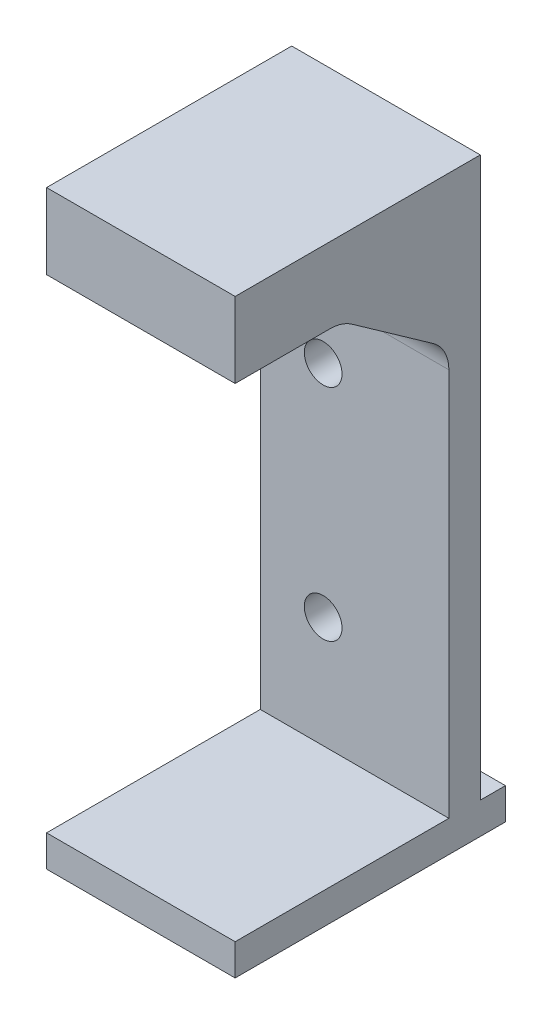
ISO-10303-21;
HEADER;
FILE_DESCRIPTION(('STEP AP214'),'2;1');
FILE_NAME('part.step','',(''),(''),'','','');
FILE_SCHEMA(('AUTOMOTIVE_DESIGN { 1 0 10303 214 1 1 1 1 }'));
ENDSEC;
DATA;
#1=APPLICATION_CONTEXT('core data for automotive mechanical design processes');
#2=APPLICATION_PROTOCOL_DEFINITION('international standard','automotive_design',2000,#1);
#3=PRODUCT_CONTEXT('',#1,'mechanical');
#4=PRODUCT('Part','Part','',(#3));
#5=PRODUCT_RELATED_PRODUCT_CATEGORY('part','',(#4));
#6=PRODUCT_DEFINITION_FORMATION('','',#4);
#7=PRODUCT_DEFINITION_CONTEXT('part definition',#1,'design');
#8=PRODUCT_DEFINITION('design','',#6,#7);
#9=PRODUCT_DEFINITION_SHAPE('','',#8);
#10=(LENGTH_UNIT() NAMED_UNIT(*) SI_UNIT(.MILLI.,.METRE.));
#11=(NAMED_UNIT(*) PLANE_ANGLE_UNIT() SI_UNIT($,.RADIAN.));
#12=(NAMED_UNIT(*) SI_UNIT($,.STERADIAN.) SOLID_ANGLE_UNIT());
#13=UNCERTAINTY_MEASURE_WITH_UNIT(LENGTH_MEASURE(1.E-05),#10,'distance_accuracy_value','');
#14=(GEOMETRIC_REPRESENTATION_CONTEXT(3) GLOBAL_UNCERTAINTY_ASSIGNED_CONTEXT((#13)) GLOBAL_UNIT_ASSIGNED_CONTEXT((#10,
#11,#12)) REPRESENTATION_CONTEXT('',''));
#15=CARTESIAN_POINT('',(0.,0.,0.));
#16=DIRECTION('',(0.,0.,1.));
#17=DIRECTION('',(1.,0.,0.));
#18=AXIS2_PLACEMENT_3D('',#15,#16,#17);
#19=CARTESIAN_POINT('',(0.,0.,2.5));
#20=DIRECTION('',(0.,0.,-1.));
#21=DIRECTION('',(-1.,0.,0.));
#22=AXIS2_PLACEMENT_3D('',#19,#20,#21);
#23=PLANE('',#22);
#24=CARTESIAN_POINT('',(5.,8.85,2.5));
#25=DIRECTION('',(0.,0.,1.));
#26=DIRECTION('',(1.,0.,0.));
#27=AXIS2_PLACEMENT_3D('',#24,#25,#26);
#28=CIRCLE('',#27,1.5);
#29=CARTESIAN_POINT('',(6.5,8.85,2.5));
#30=VERTEX_POINT('',#29);
#31=EDGE_CURVE('E236',#30,#30,#28,.T.);
#32=ORIENTED_EDGE('',*,*,#31,.F.);
#33=EDGE_LOOP('',(#32));
#34=FACE_BOUND('',#33,.T.);
#35=CARTESIAN_POINT('',(5.,26.35,2.5));
#36=DIRECTION('',(0.,0.,1.));
#37=DIRECTION('',(1.,0.,0.));
#38=AXIS2_PLACEMENT_3D('',#35,#36,#37);
#39=CIRCLE('',#38,1.5);
#40=CARTESIAN_POINT('',(6.5,26.35,2.5));
#41=VERTEX_POINT('',#40);
#42=EDGE_CURVE('E244',#41,#41,#39,.T.);
#43=ORIENTED_EDGE('',*,*,#42,.F.);
#44=EDGE_LOOP('',(#43));
#45=FACE_BOUND('',#44,.T.);
#46=DIRECTION('',(0.,1.,0.));
#47=VECTOR('',#46,1.);
#48=CARTESIAN_POINT('',(15.,0.,2.5));
#49=LINE('',#48,#47);
#50=CARTESIAN_POINT('',(15.,0.,2.5));
#51=VERTEX_POINT('',#50);
#52=CARTESIAN_POINT('',(15.,30.8955319917615,2.5));
#53=VERTEX_POINT('',#52);
#54=EDGE_CURVE('E259',#51,#53,#49,.T.);
#55=ORIENTED_EDGE('',*,*,#54,.T.);
#56=DIRECTION('',(1.,0.,0.));
#57=VECTOR('',#56,1.);
#58=CARTESIAN_POINT('',(0.,30.8955319917615,2.5));
#59=LINE('',#58,#57);
#60=CARTESIAN_POINT('',(0.,30.8955319917615,2.5));
#61=VERTEX_POINT('',#60);
#62=EDGE_CURVE('E278',#53,#61,#59,.F.);
#63=ORIENTED_EDGE('',*,*,#62,.T.);
#64=DIRECTION('',(0.,-1.,0.));
#65=VECTOR('',#64,1.);
#66=CARTESIAN_POINT('',(0.,0.,2.5));
#67=LINE('',#66,#65);
#68=CARTESIAN_POINT('',(0.,0.,2.5));
#69=VERTEX_POINT('',#68);
#70=EDGE_CURVE('E252',#61,#69,#67,.T.);
#71=ORIENTED_EDGE('',*,*,#70,.T.);
#72=DIRECTION('',(1.,0.,0.));
#73=VECTOR('',#72,1.);
#74=CARTESIAN_POINT('',(0.,0.,2.5));
#75=LINE('',#74,#73);
#76=EDGE_CURVE('E255',#69,#51,#75,.T.);
#77=ORIENTED_EDGE('',*,*,#76,.T.);
#78=EDGE_LOOP('',(#55,#63,#71,#77));
#79=FACE_BOUND('',#78,.T.);
#80=ADVANCED_FACE('F43',(#34,#45,#79),#23,.F.);
#81=CARTESIAN_POINT('',(0.,0.,0.));
#82=DIRECTION('',(0.,0.,-1.));
#83=DIRECTION('',(-1.,0.,0.));
#84=AXIS2_PLACEMENT_3D('',#81,#82,#83);
#85=PLANE('',#84);
#86=CARTESIAN_POINT('',(5.,26.35,0.));
#87=DIRECTION('',(0.,0.,1.));
#88=DIRECTION('',(1.,0.,0.));
#89=AXIS2_PLACEMENT_3D('',#86,#87,#88);
#90=CIRCLE('',#89,1.5);
#91=CARTESIAN_POINT('',(6.5,26.35,0.));
#92=VERTEX_POINT('',#91);
#93=EDGE_CURVE('E240',#92,#92,#90,.T.);
#94=ORIENTED_EDGE('',*,*,#93,.T.);
#95=EDGE_LOOP('',(#94));
#96=FACE_BOUND('',#95,.T.);
#97=DIRECTION('',(0.,-1.,0.));
#98=VECTOR('',#97,1.);
#99=CARTESIAN_POINT('',(0.,0.,0.));
#100=LINE('',#99,#98);
#101=CARTESIAN_POINT('',(0.,44.45,0.));
#102=VERTEX_POINT('',#101);
#103=CARTESIAN_POINT('',(0.,0.,0.));
#104=VERTEX_POINT('',#103);
#105=EDGE_CURVE('E248',#102,#104,#100,.T.);
#106=ORIENTED_EDGE('',*,*,#105,.F.);
#107=DIRECTION('',(-1.,0.,0.));
#108=VECTOR('',#107,1.);
#109=CARTESIAN_POINT('',(0.,44.45,0.));
#110=LINE('',#109,#108);
#111=CARTESIAN_POINT('',(15.,44.45,0.));
#112=VERTEX_POINT('',#111);
#113=EDGE_CURVE('E153',#112,#102,#110,.T.);
#114=ORIENTED_EDGE('',*,*,#113,.F.);
#115=DIRECTION('',(0.,1.,0.));
#116=VECTOR('',#115,1.);
#117=CARTESIAN_POINT('',(15.,0.,0.));
#118=LINE('',#117,#116);
#119=CARTESIAN_POINT('',(15.,0.,0.));
#120=VERTEX_POINT('',#119);
#121=EDGE_CURVE('E148',#120,#112,#118,.T.);
#122=ORIENTED_EDGE('',*,*,#121,.F.);
#123=DIRECTION('',(1.,0.,0.));
#124=VECTOR('',#123,1.);
#125=CARTESIAN_POINT('',(0.,0.,0.));
#126=LINE('',#125,#124);
#127=EDGE_CURVE('E267',#104,#120,#126,.T.);
#128=ORIENTED_EDGE('',*,*,#127,.F.);
#129=EDGE_LOOP('',(#106,#114,#122,#128));
#130=FACE_BOUND('',#129,.T.);
#131=CARTESIAN_POINT('',(5.,8.85,0.));
#132=DIRECTION('',(0.,0.,1.));
#133=DIRECTION('',(1.,0.,0.));
#134=AXIS2_PLACEMENT_3D('',#131,#132,#133);
#135=CIRCLE('',#134,1.5);
#136=CARTESIAN_POINT('',(6.5,8.85,0.));
#137=VERTEX_POINT('',#136);
#138=EDGE_CURVE('E231',#137,#137,#135,.T.);
#139=ORIENTED_EDGE('',*,*,#138,.T.);
#140=EDGE_LOOP('',(#139));
#141=FACE_BOUND('',#140,.T.);
#142=ADVANCED_FACE('F305',(#96,#130,#141),#85,.T.);
#143=CARTESIAN_POINT('',(0.,0.,2.5));
#144=DIRECTION('',(1.,0.,0.));
#145=DIRECTION('',(0.,0.,-1.));
#146=AXIS2_PLACEMENT_3D('',#143,#144,#145);
#147=PLANE('',#146);
#148=ORIENTED_EDGE('',*,*,#70,.F.);
#149=CARTESIAN_POINT('',(0.,30.8955319917615,5.5));
#150=DIRECTION('',(1.,0.,0.));
#151=DIRECTION('',(0.,0.,-1.));
#152=AXIS2_PLACEMENT_3D('',#149,#150,#151);
#153=CIRCLE('',#152,3.);
#154=CARTESIAN_POINT('',(0.,33.3464355815558,3.76995040720403));
#155=VERTEX_POINT('',#154);
#156=EDGE_CURVE('E287',#61,#155,#153,.T.);
#157=ORIENTED_EDGE('',*,*,#156,.T.);
#158=DIRECTION('',(0.,0.576683197598655,0.816967863264762));
#159=VECTOR('',#158,1.);
#160=CARTESIAN_POINT('',(0.,38.45,11.));
#161=LINE('',#160,#159);
#162=CARTESIAN_POINT('',(0.,37.9009035897943,10.2221134188752));
#163=VERTEX_POINT('',#162);
#164=EDGE_CURVE('E180',#155,#163,#161,.T.);
#165=ORIENTED_EDGE('',*,*,#164,.T.);
#166=CARTESIAN_POINT('',(0.,35.45,11.9521630116712));
#167=DIRECTION('',(1.,0.,0.));
#168=DIRECTION('',(0.,0.,-1.));
#169=AXIS2_PLACEMENT_3D('',#166,#167,#168);
#170=CIRCLE('',#169,3.);
#171=CARTESIAN_POINT('',(0.,38.45,11.9521630116712));
#172=VERTEX_POINT('',#171);
#173=EDGE_CURVE('E11',#163,#172,#170,.T.);
#174=ORIENTED_EDGE('',*,*,#173,.T.);
#175=DIRECTION('',(0.,0.,-1.));
#176=VECTOR('',#175,1.);
#177=CARTESIAN_POINT('',(0.,38.45,35.6554944214035));
#178=LINE('',#177,#176);
#179=CARTESIAN_POINT('',(0.,38.45,19.5));
#180=VERTEX_POINT('',#179);
#181=EDGE_CURVE('E185',#180,#172,#178,.T.);
#182=ORIENTED_EDGE('',*,*,#181,.F.);
#183=DIRECTION('',(0.,-1.,0.));
#184=VECTOR('',#183,1.);
#185=CARTESIAN_POINT('',(0.,44.45,19.5));
#186=LINE('',#185,#184);
#187=CARTESIAN_POINT('',(0.,44.45,19.5));
#188=VERTEX_POINT('',#187);
#189=EDGE_CURVE('E164',#188,#180,#186,.T.);
#190=ORIENTED_EDGE('',*,*,#189,.F.);
#191=DIRECTION('',(0.,0.,1.));
#192=VECTOR('',#191,1.);
#193=CARTESIAN_POINT('',(0.,44.45,0.));
#194=LINE('',#193,#192);
#195=EDGE_CURVE('E154',#102,#188,#194,.T.);
#196=ORIENTED_EDGE('',*,*,#195,.F.);
#197=ORIENTED_EDGE('',*,*,#105,.T.);
#198=DIRECTION('',(0.,0.,1.));
#199=VECTOR('',#198,1.);
#200=CARTESIAN_POINT('',(0.,0.,-2.));
#201=LINE('',#200,#199);
#202=CARTESIAN_POINT('',(0.,0.,-2.));
#203=VERTEX_POINT('',#202);
#204=EDGE_CURVE('E228',#203,#104,#201,.T.);
#205=ORIENTED_EDGE('',*,*,#204,.F.);
#206=DIRECTION('',(0.,-1.,0.));
#207=VECTOR('',#206,1.);
#208=CARTESIAN_POINT('',(0.,0.,-2.));
#209=LINE('',#208,#207);
#210=CARTESIAN_POINT('',(0.,-2.5,-2.));
#211=VERTEX_POINT('',#210);
#212=EDGE_CURVE('E216',#203,#211,#209,.T.);
#213=ORIENTED_EDGE('',*,*,#212,.T.);
#214=DIRECTION('',(0.,0.,1.));
#215=VECTOR('',#214,1.);
#216=CARTESIAN_POINT('',(0.,-2.5,-17.2069063257455));
#217=LINE('',#216,#215);
#218=CARTESIAN_POINT('',(0.,-2.5,19.5));
#219=VERTEX_POINT('',#218);
#220=EDGE_CURVE('E176',#211,#219,#217,.T.);
#221=ORIENTED_EDGE('',*,*,#220,.T.);
#222=DIRECTION('',(0.,-1.,0.));
#223=VECTOR('',#222,1.);
#224=CARTESIAN_POINT('',(0.,0.,19.5));
#225=LINE('',#224,#223);
#226=CARTESIAN_POINT('',(0.,0.,19.5));
#227=VERTEX_POINT('',#226);
#228=EDGE_CURVE('E205',#227,#219,#225,.T.);
#229=ORIENTED_EDGE('',*,*,#228,.F.);
#230=EDGE_CURVE('E232',#69,#227,#201,.T.);
#231=ORIENTED_EDGE('',*,*,#230,.F.);
#232=EDGE_LOOP('',(#148,#157,#165,#174,#182,#190,#196,#197,#205,#213,#221,#229,#231));
#233=FACE_BOUND('',#232,.T.);
#234=ADVANCED_FACE('F301',(#233),#147,.F.);
#235=CARTESIAN_POINT('',(15.,0.,2.5));
#236=DIRECTION('',(-1.,0.,0.));
#237=DIRECTION('',(0.,0.,1.));
#238=AXIS2_PLACEMENT_3D('',#235,#236,#237);
#239=PLANE('',#238);
#240=ORIENTED_EDGE('',*,*,#54,.F.);
#241=DIRECTION('',(0.,0.,1.));
#242=VECTOR('',#241,1.);
#243=CARTESIAN_POINT('',(15.,0.,-2.));
#244=LINE('',#243,#242);
#245=CARTESIAN_POINT('',(15.,0.,19.5));
#246=VERTEX_POINT('',#245);
#247=EDGE_CURVE('E227',#51,#246,#244,.T.);
#248=ORIENTED_EDGE('',*,*,#247,.T.);
#249=DIRECTION('',(0.,1.,0.));
#250=VECTOR('',#249,1.);
#251=CARTESIAN_POINT('',(15.,0.,19.5));
#252=LINE('',#251,#250);
#253=CARTESIAN_POINT('',(15.,-2.5,19.5));
#254=VERTEX_POINT('',#253);
#255=EDGE_CURVE('E208',#254,#246,#252,.T.);
#256=ORIENTED_EDGE('',*,*,#255,.F.);
#257=DIRECTION('',(0.,0.,1.));
#258=VECTOR('',#257,1.);
#259=CARTESIAN_POINT('',(15.,-2.5,-17.2069063257455));
#260=LINE('',#259,#258);
#261=CARTESIAN_POINT('',(15.,-2.5,-2.));
#262=VERTEX_POINT('',#261);
#263=EDGE_CURVE('E190',#262,#254,#260,.T.);
#264=ORIENTED_EDGE('',*,*,#263,.F.);
#265=DIRECTION('',(0.,1.,0.));
#266=VECTOR('',#265,1.);
#267=CARTESIAN_POINT('',(15.,0.,-2.));
#268=LINE('',#267,#266);
#269=CARTESIAN_POINT('',(15.,0.,-2.));
#270=VERTEX_POINT('',#269);
#271=EDGE_CURVE('E219',#262,#270,#268,.T.);
#272=ORIENTED_EDGE('',*,*,#271,.T.);
#273=EDGE_CURVE('E233',#270,#120,#244,.T.);
#274=ORIENTED_EDGE('',*,*,#273,.T.);
#275=ORIENTED_EDGE('',*,*,#121,.T.);
#276=DIRECTION('',(0.,0.,-1.));
#277=VECTOR('',#276,1.);
#278=CARTESIAN_POINT('',(15.,44.45,0.));
#279=LINE('',#278,#277);
#280=CARTESIAN_POINT('',(15.,44.45,19.5));
#281=VERTEX_POINT('',#280);
#282=EDGE_CURVE('E138',#281,#112,#279,.T.);
#283=ORIENTED_EDGE('',*,*,#282,.F.);
#284=DIRECTION('',(0.,1.,0.));
#285=VECTOR('',#284,1.);
#286=CARTESIAN_POINT('',(15.,44.45,19.5));
#287=LINE('',#286,#285);
#288=CARTESIAN_POINT('',(15.,38.45,19.5));
#289=VERTEX_POINT('',#288);
#290=EDGE_CURVE('E144',#289,#281,#287,.T.);
#291=ORIENTED_EDGE('',*,*,#290,.F.);
#292=DIRECTION('',(0.,0.,-1.));
#293=VECTOR('',#292,1.);
#294=CARTESIAN_POINT('',(15.,38.45,35.6554944214035));
#295=LINE('',#294,#293);
#296=CARTESIAN_POINT('',(15.,38.45,11.9521630116712));
#297=VERTEX_POINT('',#296);
#298=EDGE_CURVE('E165',#289,#297,#295,.T.);
#299=ORIENTED_EDGE('',*,*,#298,.T.);
#300=CARTESIAN_POINT('',(15.,35.45,11.9521630116712));
#301=DIRECTION('',(-1.,0.,0.));
#302=DIRECTION('',(0.,0.,1.));
#303=AXIS2_PLACEMENT_3D('',#300,#301,#302);
#304=CIRCLE('',#303,3.);
#305=CARTESIAN_POINT('',(15.,37.9009035897943,10.2221134188752));
#306=VERTEX_POINT('',#305);
#307=EDGE_CURVE('E52',#297,#306,#304,.T.);
#308=ORIENTED_EDGE('',*,*,#307,.T.);
#309=DIRECTION('',(0.,-0.576683197598655,-0.816967863264762));
#310=VECTOR('',#309,1.);
#311=CARTESIAN_POINT('',(15.,38.45,11.));
#312=LINE('',#311,#310);
#313=CARTESIAN_POINT('',(15.,33.3464355815558,3.76995040720403));
#314=VERTEX_POINT('',#313);
#315=EDGE_CURVE('E292',#306,#314,#312,.T.);
#316=ORIENTED_EDGE('',*,*,#315,.T.);
#317=CARTESIAN_POINT('',(15.,30.8955319917615,5.5));
#318=DIRECTION('',(-1.,0.,0.));
#319=DIRECTION('',(0.,0.,1.));
#320=AXIS2_PLACEMENT_3D('',#317,#318,#319);
#321=CIRCLE('',#320,3.);
#322=EDGE_CURVE('E284',#314,#53,#321,.T.);
#323=ORIENTED_EDGE('',*,*,#322,.T.);
#324=EDGE_LOOP('',(#240,#248,#256,#264,#272,#274,#275,#283,#291,#299,#308,#316,#323));
#325=FACE_BOUND('',#324,.T.);
#326=ADVANCED_FACE('F141',(#325),#239,.F.);
#327=CARTESIAN_POINT('',(5.,26.35,2.5));
#328=DIRECTION('',(0.,0.,-1.));
#329=DIRECTION('',(-1.,0.,0.));
#330=AXIS2_PLACEMENT_3D('',#327,#328,#329);
#331=CYLINDRICAL_SURFACE('',#330,1.5);
#332=ORIENTED_EDGE('',*,*,#42,.T.);
#333=EDGE_LOOP('',(#332));
#334=FACE_BOUND('',#333,.T.);
#335=ORIENTED_EDGE('',*,*,#93,.F.);
#336=EDGE_LOOP('',(#335));
#337=FACE_BOUND('',#336,.T.);
#338=ADVANCED_FACE('F352',(#334,#337),#331,.F.);
#339=CARTESIAN_POINT('',(5.,8.85,2.5));
#340=DIRECTION('',(0.,0.,-1.));
#341=DIRECTION('',(-1.,0.,0.));
#342=AXIS2_PLACEMENT_3D('',#339,#340,#341);
#343=CYLINDRICAL_SURFACE('',#342,1.5);
#344=ORIENTED_EDGE('',*,*,#31,.T.);
#345=EDGE_LOOP('',(#344));
#346=FACE_BOUND('',#345,.T.);
#347=ORIENTED_EDGE('',*,*,#138,.F.);
#348=EDGE_LOOP('',(#347));
#349=FACE_BOUND('',#348,.T.);
#350=ADVANCED_FACE('F372',(#346,#349),#343,.F.);
#351=CARTESIAN_POINT('',(0.,0.,-2.));
#352=DIRECTION('',(0.,1.,0.));
#353=DIRECTION('',(0.,0.,1.));
#354=AXIS2_PLACEMENT_3D('',#351,#352,#353);
#355=PLANE('',#354);
#356=ORIENTED_EDGE('',*,*,#76,.F.);
#357=ORIENTED_EDGE('',*,*,#230,.T.);
#358=DIRECTION('',(-1.,0.,0.));
#359=VECTOR('',#358,1.);
#360=CARTESIAN_POINT('',(0.,0.,19.5));
#361=LINE('',#360,#359);
#362=EDGE_CURVE('E212',#246,#227,#361,.T.);
#363=ORIENTED_EDGE('',*,*,#362,.F.);
#364=ORIENTED_EDGE('',*,*,#247,.F.);
#365=EDGE_LOOP('',(#356,#357,#363,#364));
#366=FACE_BOUND('',#365,.T.);
#367=ADVANCED_FACE('F325',(#366),#355,.T.);
#368=ORIENTED_EDGE('',*,*,#204,.T.);
#369=ORIENTED_EDGE('',*,*,#127,.T.);
#370=ORIENTED_EDGE('',*,*,#273,.F.);
#371=DIRECTION('',(-1.,0.,0.));
#372=VECTOR('',#371,1.);
#373=CARTESIAN_POINT('',(0.,0.,-2.));
#374=LINE('',#373,#372);
#375=EDGE_CURVE('E223',#270,#203,#374,.T.);
#376=ORIENTED_EDGE('',*,*,#375,.T.);
#377=EDGE_LOOP('',(#368,#369,#370,#376));
#378=FACE_BOUND('',#377,.T.);
#379=ADVANCED_FACE('F308',(#378),#355,.T.);
#380=CARTESIAN_POINT('',(0.,0.,-2.));
#381=DIRECTION('',(0.,0.,1.));
#382=DIRECTION('',(1.,0.,0.));
#383=AXIS2_PLACEMENT_3D('',#380,#381,#382);
#384=PLANE('',#383);
#385=ORIENTED_EDGE('',*,*,#212,.F.);
#386=ORIENTED_EDGE('',*,*,#375,.F.);
#387=ORIENTED_EDGE('',*,*,#271,.F.);
#388=DIRECTION('',(-1.,0.,0.));
#389=VECTOR('',#388,1.);
#390=CARTESIAN_POINT('',(0.,-2.5,-2.));
#391=LINE('',#390,#389);
#392=EDGE_CURVE('E194',#262,#211,#391,.T.);
#393=ORIENTED_EDGE('',*,*,#392,.T.);
#394=EDGE_LOOP('',(#385,#386,#387,#393));
#395=FACE_BOUND('',#394,.T.);
#396=ADVANCED_FACE('F313',(#395),#384,.F.);
#397=CARTESIAN_POINT('',(0.,0.,19.5));
#398=DIRECTION('',(0.,0.,1.));
#399=DIRECTION('',(1.,0.,0.));
#400=AXIS2_PLACEMENT_3D('',#397,#398,#399);
#401=PLANE('',#400);
#402=ORIENTED_EDGE('',*,*,#228,.T.);
#403=DIRECTION('',(1.,0.,0.));
#404=VECTOR('',#403,1.);
#405=CARTESIAN_POINT('',(0.,-2.5,19.5));
#406=LINE('',#405,#404);
#407=EDGE_CURVE('E171',#219,#254,#406,.T.);
#408=ORIENTED_EDGE('',*,*,#407,.T.);
#409=ORIENTED_EDGE('',*,*,#255,.T.);
#410=ORIENTED_EDGE('',*,*,#362,.T.);
#411=EDGE_LOOP('',(#402,#408,#409,#410));
#412=FACE_BOUND('',#411,.T.);
#413=ADVANCED_FACE('F321',(#412),#401,.T.);
#414=CARTESIAN_POINT('',(0.,44.45,0.));
#415=DIRECTION('',(0.,1.,0.));
#416=DIRECTION('',(0.,0.,1.));
#417=AXIS2_PLACEMENT_3D('',#414,#415,#416);
#418=PLANE('',#417);
#419=ORIENTED_EDGE('',*,*,#195,.T.);
#420=DIRECTION('',(-1.,0.,0.));
#421=VECTOR('',#420,1.);
#422=CARTESIAN_POINT('',(0.,44.45,19.5));
#423=LINE('',#422,#421);
#424=EDGE_CURVE('E157',#281,#188,#423,.T.);
#425=ORIENTED_EDGE('',*,*,#424,.F.);
#426=ORIENTED_EDGE('',*,*,#282,.T.);
#427=ORIENTED_EDGE('',*,*,#113,.T.);
#428=EDGE_LOOP('',(#419,#425,#426,#427));
#429=FACE_BOUND('',#428,.T.);
#430=ADVANCED_FACE('F158',(#429),#418,.T.);
#431=CARTESIAN_POINT('',(0.,-2.5,-17.2069063257455));
#432=DIRECTION('',(0.,-1.,0.));
#433=DIRECTION('',(0.,0.,-1.));
#434=AXIS2_PLACEMENT_3D('',#431,#432,#433);
#435=PLANE('',#434);
#436=ORIENTED_EDGE('',*,*,#392,.F.);
#437=ORIENTED_EDGE('',*,*,#263,.T.);
#438=ORIENTED_EDGE('',*,*,#407,.F.);
#439=ORIENTED_EDGE('',*,*,#220,.F.);
#440=EDGE_LOOP('',(#436,#437,#438,#439));
#441=FACE_BOUND('',#440,.T.);
#442=ADVANCED_FACE('F319',(#441),#435,.T.);
#443=CARTESIAN_POINT('',(0.,38.45,35.6554944214035));
#444=DIRECTION('',(0.,1.,0.));
#445=DIRECTION('',(0.,0.,1.));
#446=AXIS2_PLACEMENT_3D('',#443,#444,#445);
#447=PLANE('',#446);
#448=ORIENTED_EDGE('',*,*,#181,.T.);
#449=DIRECTION('',(1.,0.,0.));
#450=VECTOR('',#449,1.);
#451=CARTESIAN_POINT('',(0.,38.45,11.9521630116712));
#452=LINE('',#451,#450);
#453=EDGE_CURVE('E281',#172,#297,#452,.T.);
#454=ORIENTED_EDGE('',*,*,#453,.T.);
#455=ORIENTED_EDGE('',*,*,#298,.F.);
#456=DIRECTION('',(1.,0.,0.));
#457=VECTOR('',#456,1.);
#458=CARTESIAN_POINT('',(0.,38.45,19.5));
#459=LINE('',#458,#457);
#460=EDGE_CURVE('E169',#180,#289,#459,.T.);
#461=ORIENTED_EDGE('',*,*,#460,.F.);
#462=EDGE_LOOP('',(#448,#454,#455,#461));
#463=FACE_BOUND('',#462,.T.);
#464=ADVANCED_FACE('F299',(#463),#447,.F.);
#465=CARTESIAN_POINT('',(0.,0.,19.5));
#466=DIRECTION('',(0.,0.,1.));
#467=DIRECTION('',(1.,0.,0.));
#468=AXIS2_PLACEMENT_3D('',#465,#466,#467);
#469=PLANE('',#468);
#470=ORIENTED_EDGE('',*,*,#424,.T.);
#471=ORIENTED_EDGE('',*,*,#189,.T.);
#472=ORIENTED_EDGE('',*,*,#460,.T.);
#473=ORIENTED_EDGE('',*,*,#290,.T.);
#474=EDGE_LOOP('',(#470,#471,#472,#473));
#475=FACE_BOUND('',#474,.T.);
#476=ADVANCED_FACE('F168',(#475),#469,.T.);
#477=CARTESIAN_POINT('',(-10.4043260233424,38.45,11.));
#478=DIRECTION('',(0.,-0.816967863264762,0.576683197598655));
#479=DIRECTION('',(0.,-0.576683197598655,-0.816967863264762));
#480=AXIS2_PLACEMENT_3D('',#477,#478,#479);
#481=PLANE('',#480);
#482=ORIENTED_EDGE('',*,*,#164,.F.);
#483=DIRECTION('',(1.,0.,0.));
#484=VECTOR('',#483,1.);
#485=CARTESIAN_POINT('',(-10.4043260233424,33.3464355815558,3.76995040720403));
#486=LINE('',#485,#484);
#487=EDGE_CURVE('E274',#155,#314,#486,.T.);
#488=ORIENTED_EDGE('',*,*,#487,.T.);
#489=ORIENTED_EDGE('',*,*,#315,.F.);
#490=DIRECTION('',(1.,0.,0.));
#491=VECTOR('',#490,1.);
#492=CARTESIAN_POINT('',(-10.4043260233424,37.9009035897943,10.2221134188752));
#493=LINE('',#492,#491);
#494=EDGE_CURVE('E263',#306,#163,#493,.F.);
#495=ORIENTED_EDGE('',*,*,#494,.T.);
#496=EDGE_LOOP('',(#482,#488,#489,#495));
#497=FACE_BOUND('',#496,.T.);
#498=ADVANCED_FACE('F295',(#497),#481,.T.);
#499=CARTESIAN_POINT('',(-10.4043260233424,30.8955319917615,5.5));
#500=DIRECTION('',(1.,0.,0.));
#501=DIRECTION('',(0.,0.,-1.));
#502=AXIS2_PLACEMENT_3D('',#499,#500,#501);
#503=CYLINDRICAL_SURFACE('',#502,3.);
#504=ORIENTED_EDGE('',*,*,#156,.F.);
#505=ORIENTED_EDGE('',*,*,#62,.F.);
#506=ORIENTED_EDGE('',*,*,#322,.F.);
#507=ORIENTED_EDGE('',*,*,#487,.F.);
#508=EDGE_LOOP('',(#504,#505,#506,#507));
#509=FACE_BOUND('',#508,.T.);
#510=ADVANCED_FACE('F332',(#509),#503,.F.);
#511=CARTESIAN_POINT('',(0.,35.45,11.9521630116712));
#512=DIRECTION('',(1.,0.,0.));
#513=DIRECTION('',(0.,0.,-1.));
#514=AXIS2_PLACEMENT_3D('',#511,#512,#513);
#515=CYLINDRICAL_SURFACE('',#514,3.);
#516=ORIENTED_EDGE('',*,*,#173,.F.);
#517=ORIENTED_EDGE('',*,*,#494,.F.);
#518=ORIENTED_EDGE('',*,*,#307,.F.);
#519=ORIENTED_EDGE('',*,*,#453,.F.);
#520=EDGE_LOOP('',(#516,#517,#518,#519));
#521=FACE_BOUND('',#520,.T.);
#522=ADVANCED_FACE('F45',(#521),#515,.F.);
#523=CLOSED_SHELL('',(#80,#142,#234,#326,#338,#350,#367,#379,#396,#413,#430,#442,#464,#476,#498,
#510,#522));
#524=MANIFOLD_SOLID_BREP('B2',#523);
#525=ADVANCED_BREP_SHAPE_REPRESENTATION('',(#18,#524),#14);
#526=SHAPE_DEFINITION_REPRESENTATION(#9,#525);
ENDSEC;
END-ISO-10303-21;
